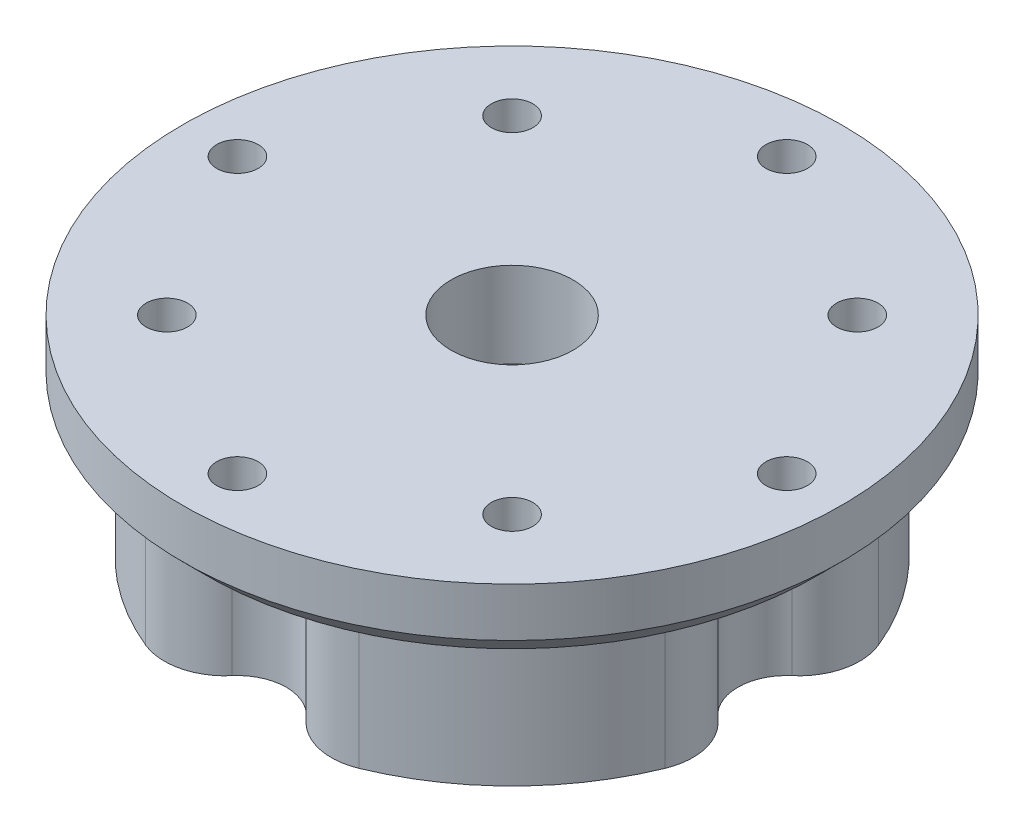
ISO-10303-21;
HEADER;
FILE_DESCRIPTION(('STEP AP214'),'2;1');
FILE_NAME('part.step','',(''),(''),'','','');
FILE_SCHEMA(('AUTOMOTIVE_DESIGN { 1 0 10303 214 1 1 1 1 }'));
ENDSEC;
DATA;
#1=APPLICATION_CONTEXT('core data for automotive mechanical design processes');
#2=APPLICATION_PROTOCOL_DEFINITION('international standard','automotive_design',2000,#1);
#3=PRODUCT_CONTEXT('',#1,'mechanical');
#4=PRODUCT('Part','Part','',(#3));
#5=PRODUCT_RELATED_PRODUCT_CATEGORY('part','',(#4));
#6=PRODUCT_DEFINITION_FORMATION('','',#4);
#7=PRODUCT_DEFINITION_CONTEXT('part definition',#1,'design');
#8=PRODUCT_DEFINITION('design','',#6,#7);
#9=PRODUCT_DEFINITION_SHAPE('','',#8);
#10=(LENGTH_UNIT() NAMED_UNIT(*) SI_UNIT(.MILLI.,.METRE.));
#11=(NAMED_UNIT(*) PLANE_ANGLE_UNIT() SI_UNIT($,.RADIAN.));
#12=(NAMED_UNIT(*) SI_UNIT($,.STERADIAN.) SOLID_ANGLE_UNIT());
#13=UNCERTAINTY_MEASURE_WITH_UNIT(LENGTH_MEASURE(1.E-05),#10,'distance_accuracy_value','');
#14=(GEOMETRIC_REPRESENTATION_CONTEXT(3) GLOBAL_UNCERTAINTY_ASSIGNED_CONTEXT((#13)) GLOBAL_UNIT_ASSIGNED_CONTEXT((#10,
#11,#12)) REPRESENTATION_CONTEXT('',''));
#15=CARTESIAN_POINT('',(0.,0.,0.));
#16=DIRECTION('',(0.,0.,1.));
#17=DIRECTION('',(1.,0.,0.));
#18=AXIS2_PLACEMENT_3D('',#15,#16,#17);
#19=CARTESIAN_POINT('',(0.,0.,-22.5));
#20=DIRECTION('',(0.,-1.,0.));
#21=DIRECTION('',(0.,0.,-1.));
#22=AXIS2_PLACEMENT_3D('',#19,#20,#21);
#23=CYLINDRICAL_SURFACE('',#22,1.69999999999999);
#24=CARTESIAN_POINT('',(0.,17.156,-22.5));
#25=DIRECTION('',(0.,-1.,0.));
#26=DIRECTION('',(0.,0.,-1.));
#27=AXIS2_PLACEMENT_3D('',#24,#25,#26);
#28=CIRCLE('',#27,1.7);
#29=CARTESIAN_POINT('',(0.,17.156,-24.2));
#30=VERTEX_POINT('',#29);
#31=EDGE_CURVE('E460',#30,#30,#28,.T.);
#32=ORIENTED_EDGE('',*,*,#31,.F.);
#33=EDGE_LOOP('',(#32));
#34=FACE_BOUND('',#33,.T.);
#35=CARTESIAN_POINT('',(0.,11.156,-22.5));
#36=DIRECTION('',(0.,-1.,0.));
#37=DIRECTION('',(0.,0.,-1.));
#38=AXIS2_PLACEMENT_3D('',#35,#36,#37);
#39=CIRCLE('',#38,1.69999999999999);
#40=CARTESIAN_POINT('',(0.,11.156,-24.2));
#41=VERTEX_POINT('',#40);
#42=EDGE_CURVE('E464',#41,#41,#39,.T.);
#43=ORIENTED_EDGE('',*,*,#42,.T.);
#44=EDGE_LOOP('',(#43));
#45=FACE_BOUND('',#44,.T.);
#46=ADVANCED_FACE('F49',(#34,#45),#23,.F.);
#47=CARTESIAN_POINT('',(22.5,0.,0.));
#48=DIRECTION('',(0.,-1.,0.));
#49=DIRECTION('',(0.,0.,-1.));
#50=AXIS2_PLACEMENT_3D('',#47,#48,#49);
#51=CYLINDRICAL_SURFACE('',#50,1.69999999999999);
#52=CARTESIAN_POINT('',(22.5,17.156,0.));
#53=DIRECTION('',(0.,-1.,0.));
#54=DIRECTION('',(0.,0.,-1.));
#55=AXIS2_PLACEMENT_3D('',#52,#53,#54);
#56=CIRCLE('',#55,1.7);
#57=CARTESIAN_POINT('',(22.5,17.156,-1.7));
#58=VERTEX_POINT('',#57);
#59=EDGE_CURVE('E444',#58,#58,#56,.T.);
#60=ORIENTED_EDGE('',*,*,#59,.F.);
#61=EDGE_LOOP('',(#60));
#62=FACE_BOUND('',#61,.T.);
#63=CARTESIAN_POINT('',(22.5,11.156,0.));
#64=DIRECTION('',(0.,-1.,0.));
#65=DIRECTION('',(0.,0.,-1.));
#66=AXIS2_PLACEMENT_3D('',#63,#64,#65);
#67=CIRCLE('',#66,1.69999999999999);
#68=CARTESIAN_POINT('',(22.5,11.156,-1.69999999999999));
#69=VERTEX_POINT('',#68);
#70=EDGE_CURVE('E448',#69,#69,#67,.T.);
#71=ORIENTED_EDGE('',*,*,#70,.T.);
#72=EDGE_LOOP('',(#71));
#73=FACE_BOUND('',#72,.T.);
#74=ADVANCED_FACE('F311',(#62,#73),#51,.F.);
#75=CARTESIAN_POINT('',(-2.35674990371912E-13,0.,22.5));
#76=DIRECTION('',(0.,-1.,0.));
#77=DIRECTION('',(0.,0.,-1.));
#78=AXIS2_PLACEMENT_3D('',#75,#76,#77);
#79=CYLINDRICAL_SURFACE('',#78,1.69999999999999);
#80=CARTESIAN_POINT('',(-2.35674990371912E-13,17.156,22.5));
#81=DIRECTION('',(0.,-1.,0.));
#82=DIRECTION('',(0.,0.,-1.));
#83=AXIS2_PLACEMENT_3D('',#80,#81,#82);
#84=CIRCLE('',#83,1.7);
#85=CARTESIAN_POINT('',(-2.35674990371912E-13,17.156,20.8));
#86=VERTEX_POINT('',#85);
#87=EDGE_CURVE('E427',#86,#86,#84,.T.);
#88=ORIENTED_EDGE('',*,*,#87,.F.);
#89=EDGE_LOOP('',(#88));
#90=FACE_BOUND('',#89,.T.);
#91=CARTESIAN_POINT('',(-2.35674990371912E-13,11.156,22.5));
#92=DIRECTION('',(0.,-1.,0.));
#93=DIRECTION('',(0.,0.,-1.));
#94=AXIS2_PLACEMENT_3D('',#91,#92,#93);
#95=CIRCLE('',#94,1.69999999999999);
#96=CARTESIAN_POINT('',(-2.35674990371912E-13,11.156,20.8));
#97=VERTEX_POINT('',#96);
#98=EDGE_CURVE('E431',#97,#97,#95,.T.);
#99=ORIENTED_EDGE('',*,*,#98,.T.);
#100=EDGE_LOOP('',(#99));
#101=FACE_BOUND('',#100,.T.);
#102=ADVANCED_FACE('F318',(#90,#101),#79,.F.);
#103=CARTESIAN_POINT('',(0.,17.156,0.));
#104=DIRECTION('',(0.,1.,0.));
#105=DIRECTION('',(0.,0.,1.));
#106=AXIS2_PLACEMENT_3D('',#103,#104,#105);
#107=PLANE('',#106);
#108=CARTESIAN_POINT('',(0.,17.156,0.));
#109=DIRECTION('',(0.,1.,0.));
#110=DIRECTION('',(0.,0.,1.));
#111=AXIS2_PLACEMENT_3D('',#108,#109,#110);
#112=CIRCLE('',#111,5.);
#113=CARTESIAN_POINT('',(0.,17.156,5.));
#114=VERTEX_POINT('',#113);
#115=EDGE_CURVE('E566',#114,#114,#112,.T.);
#116=ORIENTED_EDGE('',*,*,#115,.F.);
#117=EDGE_LOOP('',(#116));
#118=FACE_BOUND('',#117,.T.);
#119=CARTESIAN_POINT('',(-14.1421356237311,17.156,14.1421356237308));
#120=DIRECTION('',(0.,-1.,0.));
#121=DIRECTION('',(0.,0.,-1.));
#122=AXIS2_PLACEMENT_3D('',#119,#120,#121);
#123=CIRCLE('',#122,1.7);
#124=CARTESIAN_POINT('',(-14.1421356237311,17.156,12.4421356237308));
#125=VERTEX_POINT('',#124);
#126=EDGE_CURVE('E440',#125,#125,#123,.T.);
#127=ORIENTED_EDGE('',*,*,#126,.T.);
#128=EDGE_LOOP('',(#127));
#129=FACE_BOUND('',#128,.T.);
#130=ORIENTED_EDGE('',*,*,#59,.T.);
#131=EDGE_LOOP('',(#130));
#132=FACE_BOUND('',#131,.T.);
#133=CARTESIAN_POINT('',(0.,17.156,0.));
#134=DIRECTION('',(0.,-1.,0.));
#135=DIRECTION('',(0.,0.,-1.));
#136=AXIS2_PLACEMENT_3D('',#133,#134,#135);
#137=CIRCLE('',#136,27.);
#138=CARTESIAN_POINT('',(0.,17.156,-27.));
#139=VERTEX_POINT('',#138);
#140=EDGE_CURVE('E191',#139,#139,#137,.T.);
#141=ORIENTED_EDGE('',*,*,#140,.F.);
#142=EDGE_LOOP('',(#141));
#143=FACE_BOUND('',#142,.T.);
#144=CARTESIAN_POINT('',(-14.1421356237309,17.156,-14.142135623731));
#145=DIRECTION('',(0.,-1.,0.));
#146=DIRECTION('',(0.,0.,-1.));
#147=AXIS2_PLACEMENT_3D('',#144,#145,#146);
#148=CIRCLE('',#147,1.7);
#149=CARTESIAN_POINT('',(-14.1421356237309,17.156,-15.842135623731));
#150=VERTEX_POINT('',#149);
#151=EDGE_CURVE('E495',#150,#150,#148,.T.);
#152=ORIENTED_EDGE('',*,*,#151,.T.);
#153=EDGE_LOOP('',(#152));
#154=FACE_BOUND('',#153,.T.);
#155=CARTESIAN_POINT('',(-22.5,17.156,0.));
#156=DIRECTION('',(0.,-1.,0.));
#157=DIRECTION('',(0.,0.,-1.));
#158=AXIS2_PLACEMENT_3D('',#155,#156,#157);
#159=CIRCLE('',#158,1.7);
#160=CARTESIAN_POINT('',(-22.5,17.156,-1.7));
#161=VERTEX_POINT('',#160);
#162=EDGE_CURVE('E483',#161,#161,#159,.T.);
#163=ORIENTED_EDGE('',*,*,#162,.T.);
#164=EDGE_LOOP('',(#163));
#165=FACE_BOUND('',#164,.T.);
#166=CARTESIAN_POINT('',(14.142135623731,17.156,-14.1421356237309));
#167=DIRECTION('',(0.,-1.,0.));
#168=DIRECTION('',(0.,0.,-1.));
#169=AXIS2_PLACEMENT_3D('',#166,#167,#168);
#170=CIRCLE('',#169,1.69999999999999);
#171=CARTESIAN_POINT('',(14.142135623731,17.156,-15.8421356237309));
#172=VERTEX_POINT('',#171);
#173=EDGE_CURVE('E472',#172,#172,#170,.T.);
#174=ORIENTED_EDGE('',*,*,#173,.T.);
#175=EDGE_LOOP('',(#174));
#176=FACE_BOUND('',#175,.T.);
#177=ORIENTED_EDGE('',*,*,#31,.T.);
#178=EDGE_LOOP('',(#177));
#179=FACE_BOUND('',#178,.T.);
#180=CARTESIAN_POINT('',(14.1421356237309,17.156,14.142135623731));
#181=DIRECTION('',(0.,-1.,0.));
#182=DIRECTION('',(0.,0.,-1.));
#183=AXIS2_PLACEMENT_3D('',#180,#181,#182);
#184=CIRCLE('',#183,1.7);
#185=CARTESIAN_POINT('',(14.1421356237309,17.156,12.442135623731));
#186=VERTEX_POINT('',#185);
#187=EDGE_CURVE('E456',#186,#186,#184,.T.);
#188=ORIENTED_EDGE('',*,*,#187,.T.);
#189=EDGE_LOOP('',(#188));
#190=FACE_BOUND('',#189,.T.);
#191=ORIENTED_EDGE('',*,*,#87,.T.);
#192=EDGE_LOOP('',(#191));
#193=FACE_BOUND('',#192,.T.);
#194=ADVANCED_FACE('F354',(#118,#129,#132,#143,#154,#165,#176,#179,#190,#193),#107,.T.);
#195=CARTESIAN_POINT('',(0.,0.,0.));
#196=DIRECTION('',(0.,-1.,0.));
#197=DIRECTION('',(0.,0.,-1.));
#198=AXIS2_PLACEMENT_3D('',#195,#196,#197);
#199=CYLINDRICAL_SURFACE('',#198,23.);
#200=CARTESIAN_POINT('',(0.,0.,0.));
#201=DIRECTION('',(0.,-1.,0.));
#202=DIRECTION('',(0.,0.,-1.));
#203=AXIS2_PLACEMENT_3D('',#200,#201,#202);
#204=CIRCLE('',#203,23.);
#205=CARTESIAN_POINT('',(-8.73924338830336,0.,21.2749999999999));
#206=VERTEX_POINT('',#205);
#207=CARTESIAN_POINT('',(-21.275,0.,8.73924338830313));
#208=VERTEX_POINT('',#207);
#209=EDGE_CURVE('E499',#206,#208,#204,.T.);
#210=ORIENTED_EDGE('',*,*,#209,.F.);
#211=DIRECTION('',(0.,-1.,0.));
#212=VECTOR('',#211,1.);
#213=CARTESIAN_POINT('',(-8.73924338830336,0.,21.2749999999999));
#214=LINE('',#213,#212);
#215=CARTESIAN_POINT('',(-8.73924338830336,11.156,21.2749999999999));
#216=VERTEX_POINT('',#215);
#217=EDGE_CURVE('E66',#206,#216,#214,.F.);
#218=ORIENTED_EDGE('',*,*,#217,.T.);
#219=CARTESIAN_POINT('',(0.,11.156,0.));
#220=DIRECTION('',(0.,-1.,0.));
#221=DIRECTION('',(0.,0.,-1.));
#222=AXIS2_PLACEMENT_3D('',#219,#220,#221);
#223=CIRCLE('',#222,23.);
#224=CARTESIAN_POINT('',(-21.275,11.156,8.73924338830313));
#225=VERTEX_POINT('',#224);
#226=EDGE_CURVE('E194',#216,#225,#223,.T.);
#227=ORIENTED_EDGE('',*,*,#226,.T.);
#228=DIRECTION('',(0.,-1.,0.));
#229=VECTOR('',#228,1.);
#230=CARTESIAN_POINT('',(-21.275,0.,8.73924338830314));
#231=LINE('',#230,#229);
#232=EDGE_CURVE('E178',#225,#208,#231,.T.);
#233=ORIENTED_EDGE('',*,*,#232,.T.);
#234=EDGE_LOOP('',(#210,#218,#227,#233));
#235=FACE_BOUND('',#234,.T.);
#236=ADVANCED_FACE('F347',(#235),#199,.T.);
#237=CARTESIAN_POINT('',(21.275,11.156,8.73924338830313));
#238=VERTEX_POINT('',#237);
#239=CARTESIAN_POINT('',(8.73924338830291,11.156,21.2750000000001));
#240=VERTEX_POINT('',#239);
#241=EDGE_CURVE('E526',#238,#240,#223,.T.);
#242=ORIENTED_EDGE('',*,*,#241,.T.);
#243=DIRECTION('',(0.,-1.,0.));
#244=VECTOR('',#243,1.);
#245=CARTESIAN_POINT('',(8.73924338830291,0.,21.2750000000001));
#246=LINE('',#245,#244);
#247=CARTESIAN_POINT('',(8.73924338830291,0.,21.2750000000001));
#248=VERTEX_POINT('',#247);
#249=EDGE_CURVE('E258',#240,#248,#246,.T.);
#250=ORIENTED_EDGE('',*,*,#249,.T.);
#251=CARTESIAN_POINT('',(21.275,0.,8.73924338830313));
#252=VERTEX_POINT('',#251);
#253=EDGE_CURVE('E855',#252,#248,#204,.T.);
#254=ORIENTED_EDGE('',*,*,#253,.F.);
#255=DIRECTION('',(0.,-1.,0.));
#256=VECTOR('',#255,1.);
#257=CARTESIAN_POINT('',(21.275,0.,8.73924338830314));
#258=LINE('',#257,#256);
#259=EDGE_CURVE('E249',#252,#238,#258,.F.);
#260=ORIENTED_EDGE('',*,*,#259,.T.);
#261=EDGE_LOOP('',(#242,#250,#254,#260));
#262=FACE_BOUND('',#261,.T.);
#263=ADVANCED_FACE('F644',(#262),#199,.T.);
#264=CARTESIAN_POINT('',(8.73924338830321,11.156,-21.275));
#265=VERTEX_POINT('',#264);
#266=CARTESIAN_POINT('',(21.275,11.156,-8.73924338830313));
#267=VERTEX_POINT('',#266);
#268=EDGE_CURVE('E192',#265,#267,#223,.T.);
#269=ORIENTED_EDGE('',*,*,#268,.T.);
#270=DIRECTION('',(0.,-1.,0.));
#271=VECTOR('',#270,1.);
#272=CARTESIAN_POINT('',(21.275,0.,-8.73924338830314));
#273=LINE('',#272,#271);
#274=CARTESIAN_POINT('',(21.275,0.,-8.73924338830313));
#275=VERTEX_POINT('',#274);
#276=EDGE_CURVE('E232',#267,#275,#273,.T.);
#277=ORIENTED_EDGE('',*,*,#276,.T.);
#278=CARTESIAN_POINT('',(8.73924338830321,0.,-21.275));
#279=VERTEX_POINT('',#278);
#280=EDGE_CURVE('E501',#279,#275,#204,.T.);
#281=ORIENTED_EDGE('',*,*,#280,.F.);
#282=DIRECTION('',(0.,-1.,0.));
#283=VECTOR('',#282,1.);
#284=CARTESIAN_POINT('',(8.73924338830321,0.,-21.275));
#285=LINE('',#284,#283);
#286=EDGE_CURVE('E224',#279,#265,#285,.F.);
#287=ORIENTED_EDGE('',*,*,#286,.T.);
#288=EDGE_LOOP('',(#269,#277,#281,#287));
#289=FACE_BOUND('',#288,.T.);
#290=ADVANCED_FACE('F340',(#289),#199,.T.);
#291=CARTESIAN_POINT('',(-22.5,0.,0.));
#292=DIRECTION('',(0.,-1.,0.));
#293=DIRECTION('',(0.,0.,-1.));
#294=AXIS2_PLACEMENT_3D('',#291,#292,#293);
#295=CYLINDRICAL_SURFACE('',#294,1.69999999999999);
#296=ORIENTED_EDGE('',*,*,#162,.F.);
#297=EDGE_LOOP('',(#296));
#298=FACE_BOUND('',#297,.T.);
#299=CARTESIAN_POINT('',(-22.5,11.156,0.));
#300=DIRECTION('',(0.,-1.,0.));
#301=DIRECTION('',(0.,0.,-1.));
#302=AXIS2_PLACEMENT_3D('',#299,#300,#301);
#303=CIRCLE('',#302,1.69999999999999);
#304=CARTESIAN_POINT('',(-22.5,11.156,-1.69999999999999));
#305=VERTEX_POINT('',#304);
#306=EDGE_CURVE('E487',#305,#305,#303,.T.);
#307=ORIENTED_EDGE('',*,*,#306,.T.);
#308=EDGE_LOOP('',(#307));
#309=FACE_BOUND('',#308,.T.);
#310=ADVANCED_FACE('F336',(#298,#309),#295,.F.);
#311=CARTESIAN_POINT('',(23.,0.,0.));
#312=DIRECTION('',(0.,-1.,0.));
#313=DIRECTION('',(0.,0.,-1.));
#314=AXIS2_PLACEMENT_3D('',#311,#312,#313);
#315=PLANE('',#314);
#316=CARTESIAN_POINT('',(0.,0.,0.));
#317=DIRECTION('',(0.,-1.,0.));
#318=DIRECTION('',(0.,0.,-1.));
#319=AXIS2_PLACEMENT_3D('',#316,#317,#318);
#320=CIRCLE('',#319,7.55);
#321=CARTESIAN_POINT('',(0.,0.,-7.55));
#322=VERTEX_POINT('',#321);
#323=EDGE_CURVE('E292',#322,#322,#320,.F.);
#324=ORIENTED_EDGE('',*,*,#323,.T.);
#325=EDGE_LOOP('',(#324));
#326=FACE_BOUND('',#325,.T.);
#327=ORIENTED_EDGE('',*,*,#253,.T.);
#328=CARTESIAN_POINT('',(6.83940786910663,0.,16.6500000000001));
#329=DIRECTION('',(0.,-1.,0.));
#330=DIRECTION('',(0.,0.,-1.));
#331=AXIS2_PLACEMENT_3D('',#328,#329,#330);
#332=CIRCLE('',#331,5.);
#333=CARTESIAN_POINT('',(3.03973683071393,0.,19.9));
#334=VERTEX_POINT('',#333);
#335=EDGE_CURVE('E265',#248,#334,#332,.T.);
#336=ORIENTED_EDGE('',*,*,#335,.T.);
#337=CARTESIAN_POINT('',(-2.35674990371912E-13,0.,22.5));
#338=DIRECTION('',(0.,-1.,0.));
#339=DIRECTION('',(-1.,0.,0.));
#340=AXIS2_PLACEMENT_3D('',#337,#338,#339);
#341=CIRCLE('',#340,4.);
#342=CARTESIAN_POINT('',(-3.03973683071434,0.,19.9));
#343=VERTEX_POINT('',#342);
#344=EDGE_CURVE('E287',#343,#334,#341,.T.);
#345=ORIENTED_EDGE('',*,*,#344,.F.);
#346=CARTESIAN_POINT('',(-6.83940786910697,0.,16.6499999999999));
#347=DIRECTION('',(0.,-1.,0.));
#348=DIRECTION('',(0.,0.,-1.));
#349=AXIS2_PLACEMENT_3D('',#346,#347,#348);
#350=CIRCLE('',#349,5.);
#351=EDGE_CURVE('E262',#343,#206,#350,.T.);
#352=ORIENTED_EDGE('',*,*,#351,.T.);
#353=ORIENTED_EDGE('',*,*,#209,.T.);
#354=CARTESIAN_POINT('',(-16.65,0.,6.8394078691068));
#355=DIRECTION('',(0.,-1.,0.));
#356=DIRECTION('',(0.,0.,-1.));
#357=AXIS2_PLACEMENT_3D('',#354,#355,#356);
#358=CIRCLE('',#357,5.);
#359=CARTESIAN_POINT('',(-19.9,0.,3.03973683071413));
#360=VERTEX_POINT('',#359);
#361=EDGE_CURVE('E515',#208,#360,#358,.T.);
#362=ORIENTED_EDGE('',*,*,#361,.T.);
#363=CARTESIAN_POINT('',(-22.5,0.,0.));
#364=DIRECTION('',(0.,-1.,0.));
#365=DIRECTION('',(0.,0.,-1.));
#366=AXIS2_PLACEMENT_3D('',#363,#364,#365);
#367=CIRCLE('',#366,4.);
#368=CARTESIAN_POINT('',(-19.9,0.,-3.03973683071413));
#369=VERTEX_POINT('',#368);
#370=EDGE_CURVE('E476',#369,#360,#367,.T.);
#371=ORIENTED_EDGE('',*,*,#370,.F.);
#372=CARTESIAN_POINT('',(-16.65,0.,-6.8394078691068));
#373=DIRECTION('',(0.,-1.,0.));
#374=DIRECTION('',(0.,0.,-1.));
#375=AXIS2_PLACEMENT_3D('',#372,#373,#374);
#376=CIRCLE('',#375,5.);
#377=CARTESIAN_POINT('',(-21.275,0.,-8.73924338830313));
#378=VERTEX_POINT('',#377);
#379=EDGE_CURVE('E512',#369,#378,#376,.T.);
#380=ORIENTED_EDGE('',*,*,#379,.T.);
#381=CARTESIAN_POINT('',(-8.73924338830306,0.,-21.275));
#382=VERTEX_POINT('',#381);
#383=EDGE_CURVE('E174',#378,#382,#204,.T.);
#384=ORIENTED_EDGE('',*,*,#383,.T.);
#385=CARTESIAN_POINT('',(-6.83940786910674,0.,-16.65));
#386=DIRECTION('',(0.,-1.,0.));
#387=DIRECTION('',(0.,0.,-1.));
#388=AXIS2_PLACEMENT_3D('',#385,#386,#387);
#389=CIRCLE('',#388,5.);
#390=CARTESIAN_POINT('',(-3.03973683071406,0.,-19.9));
#391=VERTEX_POINT('',#390);
#392=EDGE_CURVE('E214',#382,#391,#389,.T.);
#393=ORIENTED_EDGE('',*,*,#392,.T.);
#394=CARTESIAN_POINT('',(0.,0.,-22.5));
#395=DIRECTION('',(0.,-1.,0.));
#396=DIRECTION('',(1.,0.,0.));
#397=AXIS2_PLACEMENT_3D('',#394,#395,#396);
#398=CIRCLE('',#397,4.);
#399=CARTESIAN_POINT('',(3.0397368307142,0.,-19.9));
#400=VERTEX_POINT('',#399);
#401=EDGE_CURVE('E551',#400,#391,#398,.T.);
#402=ORIENTED_EDGE('',*,*,#401,.F.);
#403=CARTESIAN_POINT('',(6.83940786910686,0.,-16.65));
#404=DIRECTION('',(0.,-1.,0.));
#405=DIRECTION('',(0.,0.,-1.));
#406=AXIS2_PLACEMENT_3D('',#403,#404,#405);
#407=CIRCLE('',#406,5.);
#408=EDGE_CURVE('E205',#400,#279,#407,.T.);
#409=ORIENTED_EDGE('',*,*,#408,.T.);
#410=ORIENTED_EDGE('',*,*,#280,.T.);
#411=CARTESIAN_POINT('',(16.65,0.,-6.8394078691068));
#412=DIRECTION('',(0.,-1.,0.));
#413=DIRECTION('',(0.,0.,-1.));
#414=AXIS2_PLACEMENT_3D('',#411,#412,#413);
#415=CIRCLE('',#414,5.);
#416=CARTESIAN_POINT('',(19.9,0.,-3.03973683071413));
#417=VERTEX_POINT('',#416);
#418=EDGE_CURVE('E239',#275,#417,#415,.T.);
#419=ORIENTED_EDGE('',*,*,#418,.T.);
#420=CARTESIAN_POINT('',(22.5,0.,0.));
#421=DIRECTION('',(0.,-1.,0.));
#422=DIRECTION('',(0.,0.,1.));
#423=AXIS2_PLACEMENT_3D('',#420,#421,#422);
#424=CIRCLE('',#423,4.);
#425=CARTESIAN_POINT('',(19.9,0.,3.03973683071413));
#426=VERTEX_POINT('',#425);
#427=EDGE_CURVE('E421',#426,#417,#424,.T.);
#428=ORIENTED_EDGE('',*,*,#427,.F.);
#429=CARTESIAN_POINT('',(16.65,0.,6.8394078691068));
#430=DIRECTION('',(0.,-1.,0.));
#431=DIRECTION('',(0.,0.,-1.));
#432=AXIS2_PLACEMENT_3D('',#429,#430,#431);
#433=CIRCLE('',#432,5.);
#434=EDGE_CURVE('E236',#426,#252,#433,.T.);
#435=ORIENTED_EDGE('',*,*,#434,.T.);
#436=EDGE_LOOP('',(#327,#336,#345,#352,#353,#362,#371,#380,#384,#393,#402,#409,#410,#419,#428,#435));
#437=FACE_BOUND('',#436,.T.);
#438=CARTESIAN_POINT('',(-14.1421356237311,0.,14.1421356237308));
#439=DIRECTION('',(0.,-1.,0.));
#440=DIRECTION('',(0.,0.,-1.));
#441=AXIS2_PLACEMENT_3D('',#438,#439,#440);
#442=CIRCLE('',#441,1.69999999999999);
#443=CARTESIAN_POINT('',(-14.1421356237311,0.,12.4421356237308));
#444=VERTEX_POINT('',#443);
#445=EDGE_CURVE('E436',#444,#444,#442,.T.);
#446=ORIENTED_EDGE('',*,*,#445,.F.);
#447=EDGE_LOOP('',(#446));
#448=FACE_BOUND('',#447,.T.);
#449=CARTESIAN_POINT('',(14.1421356237309,0.,14.142135623731));
#450=DIRECTION('',(0.,-1.,0.));
#451=DIRECTION('',(0.,0.,-1.));
#452=AXIS2_PLACEMENT_3D('',#449,#450,#451);
#453=CIRCLE('',#452,1.69999999999999);
#454=CARTESIAN_POINT('',(14.1421356237309,0.,12.442135623731));
#455=VERTEX_POINT('',#454);
#456=EDGE_CURVE('E452',#455,#455,#453,.T.);
#457=ORIENTED_EDGE('',*,*,#456,.F.);
#458=EDGE_LOOP('',(#457));
#459=FACE_BOUND('',#458,.T.);
#460=CARTESIAN_POINT('',(14.142135623731,0.,-14.1421356237309));
#461=DIRECTION('',(0.,-1.,0.));
#462=DIRECTION('',(0.,0.,-1.));
#463=AXIS2_PLACEMENT_3D('',#460,#461,#462);
#464=CIRCLE('',#463,1.69999999999999);
#465=CARTESIAN_POINT('',(14.142135623731,0.,-15.8421356237309));
#466=VERTEX_POINT('',#465);
#467=EDGE_CURVE('E468',#466,#466,#464,.T.);
#468=ORIENTED_EDGE('',*,*,#467,.F.);
#469=EDGE_LOOP('',(#468));
#470=FACE_BOUND('',#469,.T.);
#471=CARTESIAN_POINT('',(-14.1421356237309,0.,-14.142135623731));
#472=DIRECTION('',(0.,-1.,0.));
#473=DIRECTION('',(0.,0.,-1.));
#474=AXIS2_PLACEMENT_3D('',#471,#472,#473);
#475=CIRCLE('',#474,1.69999999999999);
#476=CARTESIAN_POINT('',(-14.1421356237309,0.,-15.842135623731));
#477=VERTEX_POINT('',#476);
#478=EDGE_CURVE('E491',#477,#477,#475,.T.);
#479=ORIENTED_EDGE('',*,*,#478,.F.);
#480=EDGE_LOOP('',(#479));
#481=FACE_BOUND('',#480,.T.);
#482=ADVANCED_FACE('F339',(#326,#437,#448,#459,#470,#481),#315,.T.);
#483=CARTESIAN_POINT('',(0.,0.,0.));
#484=DIRECTION('',(0.,-1.,0.));
#485=DIRECTION('',(0.,0.,-1.));
#486=AXIS2_PLACEMENT_3D('',#483,#484,#485);
#487=CYLINDRICAL_SURFACE('',#486,6.8);
#488=CARTESIAN_POINT('',(0.,0.749999999999996,0.));
#489=DIRECTION('',(0.,-1.,0.));
#490=DIRECTION('',(0.,0.,-1.));
#491=AXIS2_PLACEMENT_3D('',#488,#489,#490);
#492=CIRCLE('',#491,6.8);
#493=CARTESIAN_POINT('',(0.,0.749999999999996,-6.8));
#494=VERTEX_POINT('',#493);
#495=EDGE_CURVE('E282',#494,#494,#492,.T.);
#496=ORIENTED_EDGE('',*,*,#495,.T.);
#497=EDGE_LOOP('',(#496));
#498=FACE_BOUND('',#497,.T.);
#499=CARTESIAN_POINT('',(0.,4.953,0.));
#500=DIRECTION('',(0.,-1.,0.));
#501=DIRECTION('',(0.,0.,-1.));
#502=AXIS2_PLACEMENT_3D('',#499,#500,#501);
#503=CIRCLE('',#502,6.8);
#504=CARTESIAN_POINT('',(0.,4.953,-6.8));
#505=VERTEX_POINT('',#504);
#506=EDGE_CURVE('E179',#505,#505,#503,.T.);
#507=ORIENTED_EDGE('',*,*,#506,.F.);
#508=EDGE_LOOP('',(#507));
#509=FACE_BOUND('',#508,.T.);
#510=ADVANCED_FACE('F360',(#498,#509),#487,.F.);
#511=CARTESIAN_POINT('',(6.8,4.953,0.));
#512=DIRECTION('',(0.,-1.,0.));
#513=DIRECTION('',(0.,0.,-1.));
#514=AXIS2_PLACEMENT_3D('',#511,#512,#513);
#515=PLANE('',#514);
#516=CARTESIAN_POINT('',(0.,4.953,0.));
#517=DIRECTION('',(0.,-1.,0.));
#518=DIRECTION('',(0.,0.,-1.));
#519=AXIS2_PLACEMENT_3D('',#516,#517,#518);
#520=CIRCLE('',#519,2.75);
#521=CARTESIAN_POINT('',(0.,4.953,-2.75));
#522=VERTEX_POINT('',#521);
#523=EDGE_CURVE('E283',#522,#522,#520,.T.);
#524=ORIENTED_EDGE('',*,*,#523,.F.);
#525=EDGE_LOOP('',(#524));
#526=FACE_BOUND('',#525,.T.);
#527=ORIENTED_EDGE('',*,*,#506,.T.);
#528=EDGE_LOOP('',(#527));
#529=FACE_BOUND('',#528,.T.);
#530=ADVANCED_FACE('F352',(#526,#529),#515,.T.);
#531=CARTESIAN_POINT('',(0.,0.,0.));
#532=DIRECTION('',(0.,-1.,0.));
#533=DIRECTION('',(0.,0.,-1.));
#534=AXIS2_PLACEMENT_3D('',#531,#532,#533);
#535=CYLINDRICAL_SURFACE('',#534,27.);
#536=CARTESIAN_POINT('',(0.,13.156,0.));
#537=DIRECTION('',(0.,-1.,0.));
#538=DIRECTION('',(0.,0.,-1.));
#539=AXIS2_PLACEMENT_3D('',#536,#537,#538);
#540=CIRCLE('',#539,27.);
#541=CARTESIAN_POINT('',(0.,13.156,-27.));
#542=VERTEX_POINT('',#541);
#543=EDGE_CURVE('E11',#542,#542,#540,.F.);
#544=ORIENTED_EDGE('',*,*,#543,.T.);
#545=EDGE_LOOP('',(#544));
#546=FACE_BOUND('',#545,.T.);
#547=ORIENTED_EDGE('',*,*,#140,.T.);
#548=EDGE_LOOP('',(#547));
#549=FACE_BOUND('',#548,.T.);
#550=ADVANCED_FACE('F349',(#546,#549),#535,.T.);
#551=CARTESIAN_POINT('',(23.,11.156,0.));
#552=DIRECTION('',(0.,-1.,0.));
#553=DIRECTION('',(0.,0.,-1.));
#554=AXIS2_PLACEMENT_3D('',#551,#552,#553);
#555=PLANE('',#554);
#556=CARTESIAN_POINT('',(0.,11.156,0.));
#557=DIRECTION('',(0.,-1.,0.));
#558=DIRECTION('',(0.,0.,-1.));
#559=AXIS2_PLACEMENT_3D('',#556,#557,#558);
#560=CIRCLE('',#559,25.);
#561=CARTESIAN_POINT('',(0.,11.156,-25.));
#562=VERTEX_POINT('',#561);
#563=EDGE_CURVE('E59',#562,#562,#560,.T.);
#564=ORIENTED_EDGE('',*,*,#563,.T.);
#565=EDGE_LOOP('',(#564));
#566=FACE_BOUND('',#565,.T.);
#567=ORIENTED_EDGE('',*,*,#268,.F.);
#568=CARTESIAN_POINT('',(6.83940786910686,11.156,-16.65));
#569=DIRECTION('',(0.,-1.,0.));
#570=DIRECTION('',(0.,0.,-1.));
#571=AXIS2_PLACEMENT_3D('',#568,#569,#570);
#572=CIRCLE('',#571,5.);
#573=CARTESIAN_POINT('',(3.0397368307142,11.156,-19.9));
#574=VERTEX_POINT('',#573);
#575=EDGE_CURVE('E229',#265,#574,#572,.F.);
#576=ORIENTED_EDGE('',*,*,#575,.T.);
#577=CARTESIAN_POINT('',(0.,11.156,-22.5));
#578=DIRECTION('',(0.,-1.,0.));
#579=DIRECTION('',(0.,0.,-1.));
#580=AXIS2_PLACEMENT_3D('',#577,#578,#579);
#581=CIRCLE('',#580,4.);
#582=CARTESIAN_POINT('',(-3.03973683071406,11.156,-19.9));
#583=VERTEX_POINT('',#582);
#584=EDGE_CURVE('E432',#583,#574,#581,.F.);
#585=ORIENTED_EDGE('',*,*,#584,.F.);
#586=CARTESIAN_POINT('',(-6.83940786910674,11.156,-16.65));
#587=DIRECTION('',(0.,-1.,0.));
#588=DIRECTION('',(0.,0.,-1.));
#589=AXIS2_PLACEMENT_3D('',#586,#587,#588);
#590=CIRCLE('',#589,5.);
#591=CARTESIAN_POINT('',(-8.73924338830306,11.156,-21.275));
#592=VERTEX_POINT('',#591);
#593=EDGE_CURVE('E189',#583,#592,#590,.F.);
#594=ORIENTED_EDGE('',*,*,#593,.T.);
#595=CARTESIAN_POINT('',(-21.275,11.156,-8.73924338830313));
#596=VERTEX_POINT('',#595);
#597=EDGE_CURVE('E171',#596,#592,#223,.T.);
#598=ORIENTED_EDGE('',*,*,#597,.F.);
#599=CARTESIAN_POINT('',(-16.65,11.156,-6.8394078691068));
#600=DIRECTION('',(0.,-1.,0.));
#601=DIRECTION('',(0.,0.,-1.));
#602=AXIS2_PLACEMENT_3D('',#599,#600,#601);
#603=CIRCLE('',#602,5.);
#604=CARTESIAN_POINT('',(-19.9,11.156,-3.03973683071413));
#605=VERTEX_POINT('',#604);
#606=EDGE_CURVE('E185',#596,#605,#603,.F.);
#607=ORIENTED_EDGE('',*,*,#606,.T.);
#608=CARTESIAN_POINT('',(-22.5,11.156,0.));
#609=DIRECTION('',(0.,-1.,0.));
#610=DIRECTION('',(0.,0.,-1.));
#611=AXIS2_PLACEMENT_3D('',#608,#609,#610);
#612=CIRCLE('',#611,4.);
#613=CARTESIAN_POINT('',(-19.9,11.156,3.03973683071413));
#614=VERTEX_POINT('',#613);
#615=EDGE_CURVE('E480',#614,#605,#612,.F.);
#616=ORIENTED_EDGE('',*,*,#615,.F.);
#617=CARTESIAN_POINT('',(-16.65,11.156,6.8394078691068));
#618=DIRECTION('',(0.,-1.,0.));
#619=DIRECTION('',(0.,0.,-1.));
#620=AXIS2_PLACEMENT_3D('',#617,#618,#619);
#621=CIRCLE('',#620,5.);
#622=EDGE_CURVE('E201',#614,#225,#621,.F.);
#623=ORIENTED_EDGE('',*,*,#622,.T.);
#624=ORIENTED_EDGE('',*,*,#226,.F.);
#625=CARTESIAN_POINT('',(-6.83940786910697,11.156,16.6499999999999));
#626=DIRECTION('',(0.,-1.,0.));
#627=DIRECTION('',(0.,0.,-1.));
#628=AXIS2_PLACEMENT_3D('',#625,#626,#627);
#629=CIRCLE('',#628,5.);
#630=CARTESIAN_POINT('',(-3.03973683071434,11.156,19.9));
#631=VERTEX_POINT('',#630);
#632=EDGE_CURVE('E73',#216,#631,#629,.F.);
#633=ORIENTED_EDGE('',*,*,#632,.T.);
#634=CARTESIAN_POINT('',(-2.35674990371912E-13,11.156,22.5));
#635=DIRECTION('',(0.,-1.,0.));
#636=DIRECTION('',(0.,0.,-1.));
#637=AXIS2_PLACEMENT_3D('',#634,#635,#636);
#638=CIRCLE('',#637,4.);
#639=CARTESIAN_POINT('',(3.03973683071393,11.156,19.9));
#640=VERTEX_POINT('',#639);
#641=EDGE_CURVE('E414',#640,#631,#638,.F.);
#642=ORIENTED_EDGE('',*,*,#641,.F.);
#643=CARTESIAN_POINT('',(6.83940786910663,11.156,16.6500000000001));
#644=DIRECTION('',(0.,-1.,0.));
#645=DIRECTION('',(0.,0.,-1.));
#646=AXIS2_PLACEMENT_3D('',#643,#644,#645);
#647=CIRCLE('',#646,5.);
#648=EDGE_CURVE('E277',#640,#240,#647,.F.);
#649=ORIENTED_EDGE('',*,*,#648,.T.);
#650=ORIENTED_EDGE('',*,*,#241,.F.);
#651=CARTESIAN_POINT('',(16.65,11.156,6.8394078691068));
#652=DIRECTION('',(0.,-1.,0.));
#653=DIRECTION('',(0.,0.,-1.));
#654=AXIS2_PLACEMENT_3D('',#651,#652,#653);
#655=CIRCLE('',#654,5.);
#656=CARTESIAN_POINT('',(19.9,11.156,3.03973683071413));
#657=VERTEX_POINT('',#656);
#658=EDGE_CURVE('E255',#238,#657,#655,.F.);
#659=ORIENTED_EDGE('',*,*,#658,.T.);
#660=CARTESIAN_POINT('',(22.5,11.156,0.));
#661=DIRECTION('',(0.,-1.,0.));
#662=DIRECTION('',(0.,0.,-1.));
#663=AXIS2_PLACEMENT_3D('',#660,#661,#662);
#664=CIRCLE('',#663,4.);
#665=CARTESIAN_POINT('',(19.9,11.156,-3.03973683071413));
#666=VERTEX_POINT('',#665);
#667=EDGE_CURVE('E424',#666,#657,#664,.F.);
#668=ORIENTED_EDGE('',*,*,#667,.F.);
#669=CARTESIAN_POINT('',(16.65,11.156,-6.8394078691068));
#670=DIRECTION('',(0.,-1.,0.));
#671=DIRECTION('',(0.,0.,-1.));
#672=AXIS2_PLACEMENT_3D('',#669,#670,#671);
#673=CIRCLE('',#672,5.);
#674=EDGE_CURVE('E252',#666,#267,#673,.F.);
#675=ORIENTED_EDGE('',*,*,#674,.T.);
#676=EDGE_LOOP('',(#567,#576,#585,#594,#598,#607,#616,#623,#624,#633,#642,#649,#650,#659,#668,#675));
#677=FACE_BOUND('',#676,.T.);
#678=ORIENTED_EDGE('',*,*,#42,.F.);
#679=EDGE_LOOP('',(#678));
#680=FACE_BOUND('',#679,.T.);
#681=ORIENTED_EDGE('',*,*,#70,.F.);
#682=EDGE_LOOP('',(#681));
#683=FACE_BOUND('',#682,.T.);
#684=ORIENTED_EDGE('',*,*,#98,.F.);
#685=EDGE_LOOP('',(#684));
#686=FACE_BOUND('',#685,.T.);
#687=ORIENTED_EDGE('',*,*,#306,.F.);
#688=EDGE_LOOP('',(#687));
#689=FACE_BOUND('',#688,.T.);
#690=ADVANCED_FACE('F182',(#566,#677,#680,#683,#686,#689),#555,.T.);
#691=ORIENTED_EDGE('',*,*,#597,.T.);
#692=DIRECTION('',(0.,-1.,0.));
#693=VECTOR('',#692,1.);
#694=CARTESIAN_POINT('',(-8.73924338830306,0.,-21.275));
#695=LINE('',#694,#693);
#696=EDGE_CURVE('E200',#592,#382,#695,.T.);
#697=ORIENTED_EDGE('',*,*,#696,.T.);
#698=ORIENTED_EDGE('',*,*,#383,.F.);
#699=DIRECTION('',(0.,-1.,0.));
#700=VECTOR('',#699,1.);
#701=CARTESIAN_POINT('',(-21.275,0.,-8.73924338830314));
#702=LINE('',#701,#700);
#703=EDGE_CURVE('E167',#378,#596,#702,.F.);
#704=ORIENTED_EDGE('',*,*,#703,.T.);
#705=EDGE_LOOP('',(#691,#697,#698,#704));
#706=FACE_BOUND('',#705,.T.);
#707=ADVANCED_FACE('F169',(#706),#199,.T.);
#708=CARTESIAN_POINT('',(-14.1421356237309,0.,-14.142135623731));
#709=DIRECTION('',(0.,-1.,0.));
#710=DIRECTION('',(0.,0.,-1.));
#711=AXIS2_PLACEMENT_3D('',#708,#709,#710);
#712=CYLINDRICAL_SURFACE('',#711,1.69999999999999);
#713=ORIENTED_EDGE('',*,*,#151,.F.);
#714=EDGE_LOOP('',(#713));
#715=FACE_BOUND('',#714,.T.);
#716=ORIENTED_EDGE('',*,*,#478,.T.);
#717=EDGE_LOOP('',(#716));
#718=FACE_BOUND('',#717,.T.);
#719=ADVANCED_FACE('F334',(#715,#718),#712,.F.);
#720=CARTESIAN_POINT('',(-22.5,20.3347798753429,0.));
#721=DIRECTION('',(0.,-1.,0.));
#722=DIRECTION('',(0.,0.,-1.));
#723=AXIS2_PLACEMENT_3D('',#720,#721,#722);
#724=CYLINDRICAL_SURFACE('',#723,4.);
#725=ORIENTED_EDGE('',*,*,#370,.T.);
#726=DIRECTION('',(0.,-1.,0.));
#727=VECTOR('',#726,1.);
#728=CARTESIAN_POINT('',(-19.9,20.3347798753429,3.03973683071413));
#729=LINE('',#728,#727);
#730=EDGE_CURVE('E208',#360,#614,#729,.F.);
#731=ORIENTED_EDGE('',*,*,#730,.T.);
#732=ORIENTED_EDGE('',*,*,#615,.T.);
#733=DIRECTION('',(0.,-1.,0.));
#734=VECTOR('',#733,1.);
#735=CARTESIAN_POINT('',(-19.9,20.3347798753429,-3.03973683071413));
#736=LINE('',#735,#734);
#737=EDGE_CURVE('E198',#605,#369,#736,.T.);
#738=ORIENTED_EDGE('',*,*,#737,.T.);
#739=EDGE_LOOP('',(#725,#731,#732,#738));
#740=FACE_BOUND('',#739,.T.);
#741=ADVANCED_FACE('F330',(#740),#724,.F.);
#742=CARTESIAN_POINT('',(-16.65,20.3347798753429,6.8394078691068));
#743=DIRECTION('',(0.,1.,0.));
#744=DIRECTION('',(0.,0.,1.));
#745=AXIS2_PLACEMENT_3D('',#742,#743,#744);
#746=CYLINDRICAL_SURFACE('',#745,5.);
#747=ORIENTED_EDGE('',*,*,#622,.F.);
#748=ORIENTED_EDGE('',*,*,#730,.F.);
#749=ORIENTED_EDGE('',*,*,#361,.F.);
#750=ORIENTED_EDGE('',*,*,#232,.F.);
#751=EDGE_LOOP('',(#747,#748,#749,#750));
#752=FACE_BOUND('',#751,.T.);
#753=ADVANCED_FACE('F333',(#752),#746,.T.);
#754=CARTESIAN_POINT('',(-16.65,0.,-6.8394078691068));
#755=DIRECTION('',(0.,1.,0.));
#756=DIRECTION('',(0.,0.,1.));
#757=AXIS2_PLACEMENT_3D('',#754,#755,#756);
#758=CYLINDRICAL_SURFACE('',#757,5.);
#759=ORIENTED_EDGE('',*,*,#606,.F.);
#760=ORIENTED_EDGE('',*,*,#703,.F.);
#761=ORIENTED_EDGE('',*,*,#379,.F.);
#762=ORIENTED_EDGE('',*,*,#737,.F.);
#763=EDGE_LOOP('',(#759,#760,#761,#762));
#764=FACE_BOUND('',#763,.T.);
#765=ADVANCED_FACE('F196',(#764),#758,.T.);
#766=CARTESIAN_POINT('',(14.142135623731,0.,-14.1421356237309));
#767=DIRECTION('',(0.,-1.,0.));
#768=DIRECTION('',(0.,0.,-1.));
#769=AXIS2_PLACEMENT_3D('',#766,#767,#768);
#770=CYLINDRICAL_SURFACE('',#769,1.69999999999999);
#771=ORIENTED_EDGE('',*,*,#173,.F.);
#772=EDGE_LOOP('',(#771));
#773=FACE_BOUND('',#772,.T.);
#774=ORIENTED_EDGE('',*,*,#467,.T.);
#775=EDGE_LOOP('',(#774));
#776=FACE_BOUND('',#775,.T.);
#777=ADVANCED_FACE('F326',(#773,#776),#770,.F.);
#778=CARTESIAN_POINT('',(14.1421356237309,0.,14.142135623731));
#779=DIRECTION('',(0.,-1.,0.));
#780=DIRECTION('',(0.,0.,-1.));
#781=AXIS2_PLACEMENT_3D('',#778,#779,#780);
#782=CYLINDRICAL_SURFACE('',#781,1.69999999999999);
#783=ORIENTED_EDGE('',*,*,#187,.F.);
#784=EDGE_LOOP('',(#783));
#785=FACE_BOUND('',#784,.T.);
#786=ORIENTED_EDGE('',*,*,#456,.T.);
#787=EDGE_LOOP('',(#786));
#788=FACE_BOUND('',#787,.T.);
#789=ADVANCED_FACE('F325',(#785,#788),#782,.F.);
#790=CARTESIAN_POINT('',(-14.1421356237311,0.,14.1421356237308));
#791=DIRECTION('',(0.,-1.,0.));
#792=DIRECTION('',(0.,0.,-1.));
#793=AXIS2_PLACEMENT_3D('',#790,#791,#792);
#794=CYLINDRICAL_SURFACE('',#793,1.69999999999999);
#795=ORIENTED_EDGE('',*,*,#126,.F.);
#796=EDGE_LOOP('',(#795));
#797=FACE_BOUND('',#796,.T.);
#798=ORIENTED_EDGE('',*,*,#445,.T.);
#799=EDGE_LOOP('',(#798));
#800=FACE_BOUND('',#799,.T.);
#801=ADVANCED_FACE('F603',(#797,#800),#794,.F.);
#802=CARTESIAN_POINT('',(-2.35674990371912E-13,20.3347798753429,22.5));
#803=DIRECTION('',(0.,-1.,0.));
#804=DIRECTION('',(0.,0.,-1.));
#805=AXIS2_PLACEMENT_3D('',#802,#803,#804);
#806=CYLINDRICAL_SURFACE('',#805,4.);
#807=ORIENTED_EDGE('',*,*,#344,.T.);
#808=DIRECTION('',(0.,-1.,0.));
#809=VECTOR('',#808,1.);
#810=CARTESIAN_POINT('',(3.03973683071393,20.3347798753429,19.9));
#811=LINE('',#810,#809);
#812=EDGE_CURVE('E272',#334,#640,#811,.F.);
#813=ORIENTED_EDGE('',*,*,#812,.T.);
#814=ORIENTED_EDGE('',*,*,#641,.T.);
#815=DIRECTION('',(0.,-1.,0.));
#816=VECTOR('',#815,1.);
#817=CARTESIAN_POINT('',(-3.03973683071434,20.3347798753429,19.9));
#818=LINE('',#817,#816);
#819=EDGE_CURVE('E268',#631,#343,#818,.T.);
#820=ORIENTED_EDGE('',*,*,#819,.T.);
#821=EDGE_LOOP('',(#807,#813,#814,#820));
#822=FACE_BOUND('',#821,.T.);
#823=ADVANCED_FACE('F412',(#822),#806,.F.);
#824=CARTESIAN_POINT('',(22.5,20.3347798753429,0.));
#825=DIRECTION('',(0.,-1.,0.));
#826=DIRECTION('',(0.,0.,-1.));
#827=AXIS2_PLACEMENT_3D('',#824,#825,#826);
#828=CYLINDRICAL_SURFACE('',#827,4.);
#829=ORIENTED_EDGE('',*,*,#427,.T.);
#830=DIRECTION('',(0.,-1.,0.));
#831=VECTOR('',#830,1.);
#832=CARTESIAN_POINT('',(19.9,20.3347798753429,-3.03973683071413));
#833=LINE('',#832,#831);
#834=EDGE_CURVE('E246',#417,#666,#833,.F.);
#835=ORIENTED_EDGE('',*,*,#834,.T.);
#836=ORIENTED_EDGE('',*,*,#667,.T.);
#837=DIRECTION('',(0.,-1.,0.));
#838=VECTOR('',#837,1.);
#839=CARTESIAN_POINT('',(19.9,20.3347798753429,3.03973683071413));
#840=LINE('',#839,#838);
#841=EDGE_CURVE('E242',#657,#426,#840,.T.);
#842=ORIENTED_EDGE('',*,*,#841,.T.);
#843=EDGE_LOOP('',(#829,#835,#836,#842));
#844=FACE_BOUND('',#843,.T.);
#845=ADVANCED_FACE('F545',(#844),#828,.F.);
#846=CARTESIAN_POINT('',(0.,20.3347798753429,-22.5));
#847=DIRECTION('',(0.,-1.,0.));
#848=DIRECTION('',(0.,0.,-1.));
#849=AXIS2_PLACEMENT_3D('',#846,#847,#848);
#850=CYLINDRICAL_SURFACE('',#849,4.);
#851=ORIENTED_EDGE('',*,*,#401,.T.);
#852=DIRECTION('',(0.,-1.,0.));
#853=VECTOR('',#852,1.);
#854=CARTESIAN_POINT('',(-3.03973683071406,20.3347798753429,-19.9));
#855=LINE('',#854,#853);
#856=EDGE_CURVE('E221',#391,#583,#855,.F.);
#857=ORIENTED_EDGE('',*,*,#856,.T.);
#858=ORIENTED_EDGE('',*,*,#584,.T.);
#859=DIRECTION('',(0.,-1.,0.));
#860=VECTOR('',#859,1.);
#861=CARTESIAN_POINT('',(3.0397368307142,20.3347798753429,-19.9));
#862=LINE('',#861,#860);
#863=EDGE_CURVE('E217',#574,#400,#862,.T.);
#864=ORIENTED_EDGE('',*,*,#863,.T.);
#865=EDGE_LOOP('',(#851,#857,#858,#864));
#866=FACE_BOUND('',#865,.T.);
#867=ADVANCED_FACE('F376',(#866),#850,.F.);
#868=CARTESIAN_POINT('',(-6.83940786910674,20.3347798753429,-16.65));
#869=DIRECTION('',(0.,1.,0.));
#870=DIRECTION('',(0.,0.,1.));
#871=AXIS2_PLACEMENT_3D('',#868,#869,#870);
#872=CYLINDRICAL_SURFACE('',#871,5.);
#873=ORIENTED_EDGE('',*,*,#593,.F.);
#874=ORIENTED_EDGE('',*,*,#856,.F.);
#875=ORIENTED_EDGE('',*,*,#392,.F.);
#876=ORIENTED_EDGE('',*,*,#696,.F.);
#877=EDGE_LOOP('',(#873,#874,#875,#876));
#878=FACE_BOUND('',#877,.T.);
#879=ADVANCED_FACE('F372',(#878),#872,.T.);
#880=CARTESIAN_POINT('',(6.83940786910686,0.,-16.65));
#881=DIRECTION('',(0.,1.,0.));
#882=DIRECTION('',(0.,0.,1.));
#883=AXIS2_PLACEMENT_3D('',#880,#881,#882);
#884=CYLINDRICAL_SURFACE('',#883,5.);
#885=ORIENTED_EDGE('',*,*,#575,.F.);
#886=ORIENTED_EDGE('',*,*,#286,.F.);
#887=ORIENTED_EDGE('',*,*,#408,.F.);
#888=ORIENTED_EDGE('',*,*,#863,.F.);
#889=EDGE_LOOP('',(#885,#886,#887,#888));
#890=FACE_BOUND('',#889,.T.);
#891=ADVANCED_FACE('F375',(#890),#884,.T.);
#892=CARTESIAN_POINT('',(16.65,20.3347798753429,-6.8394078691068));
#893=DIRECTION('',(0.,1.,0.));
#894=DIRECTION('',(0.,0.,1.));
#895=AXIS2_PLACEMENT_3D('',#892,#893,#894);
#896=CYLINDRICAL_SURFACE('',#895,5.);
#897=ORIENTED_EDGE('',*,*,#674,.F.);
#898=ORIENTED_EDGE('',*,*,#834,.F.);
#899=ORIENTED_EDGE('',*,*,#418,.F.);
#900=ORIENTED_EDGE('',*,*,#276,.F.);
#901=EDGE_LOOP('',(#897,#898,#899,#900));
#902=FACE_BOUND('',#901,.T.);
#903=ADVANCED_FACE('F380',(#902),#896,.T.);
#904=CARTESIAN_POINT('',(16.65,0.,6.8394078691068));
#905=DIRECTION('',(0.,1.,0.));
#906=DIRECTION('',(0.,0.,1.));
#907=AXIS2_PLACEMENT_3D('',#904,#905,#906);
#908=CYLINDRICAL_SURFACE('',#907,5.);
#909=ORIENTED_EDGE('',*,*,#658,.F.);
#910=ORIENTED_EDGE('',*,*,#259,.F.);
#911=ORIENTED_EDGE('',*,*,#434,.F.);
#912=ORIENTED_EDGE('',*,*,#841,.F.);
#913=EDGE_LOOP('',(#909,#910,#911,#912));
#914=FACE_BOUND('',#913,.T.);
#915=ADVANCED_FACE('F384',(#914),#908,.T.);
#916=CARTESIAN_POINT('',(6.83940786910663,20.3347798753429,16.6500000000001));
#917=DIRECTION('',(0.,1.,0.));
#918=DIRECTION('',(0.,0.,1.));
#919=AXIS2_PLACEMENT_3D('',#916,#917,#918);
#920=CYLINDRICAL_SURFACE('',#919,5.);
#921=ORIENTED_EDGE('',*,*,#648,.F.);
#922=ORIENTED_EDGE('',*,*,#812,.F.);
#923=ORIENTED_EDGE('',*,*,#335,.F.);
#924=ORIENTED_EDGE('',*,*,#249,.F.);
#925=EDGE_LOOP('',(#921,#922,#923,#924));
#926=FACE_BOUND('',#925,.T.);
#927=ADVANCED_FACE('F388',(#926),#920,.T.);
#928=CARTESIAN_POINT('',(-6.83940786910697,0.,16.6499999999999));
#929=DIRECTION('',(0.,1.,0.));
#930=DIRECTION('',(0.,0.,1.));
#931=AXIS2_PLACEMENT_3D('',#928,#929,#930);
#932=CYLINDRICAL_SURFACE('',#931,5.);
#933=ORIENTED_EDGE('',*,*,#632,.F.);
#934=ORIENTED_EDGE('',*,*,#217,.F.);
#935=ORIENTED_EDGE('',*,*,#351,.F.);
#936=ORIENTED_EDGE('',*,*,#819,.F.);
#937=EDGE_LOOP('',(#933,#934,#935,#936));
#938=FACE_BOUND('',#937,.T.);
#939=ADVANCED_FACE('F392',(#938),#932,.T.);
#940=CARTESIAN_POINT('',(0.,17.156,0.));
#941=DIRECTION('',(0.,1.,0.));
#942=DIRECTION('',(0.,0.,1.));
#943=AXIS2_PLACEMENT_3D('',#940,#941,#942);
#944=CYLINDRICAL_SURFACE('',#943,2.75);
#945=ORIENTED_EDGE('',*,*,#523,.T.);
#946=EDGE_LOOP('',(#945));
#947=FACE_BOUND('',#946,.T.);
#948=CARTESIAN_POINT('',(0.,10.156,0.));
#949=DIRECTION('',(0.,1.,0.));
#950=DIRECTION('',(0.,0.,1.));
#951=AXIS2_PLACEMENT_3D('',#948,#949,#950);
#952=CIRCLE('',#951,2.75);
#953=CARTESIAN_POINT('',(0.,10.156,2.75));
#954=VERTEX_POINT('',#953);
#955=EDGE_CURVE('E288',#954,#954,#952,.T.);
#956=ORIENTED_EDGE('',*,*,#955,.T.);
#957=EDGE_LOOP('',(#956));
#958=FACE_BOUND('',#957,.T.);
#959=ADVANCED_FACE('F395',(#947,#958),#944,.F.);
#960=CARTESIAN_POINT('',(2.75,10.156,0.));
#961=DIRECTION('',(0.,-1.,0.));
#962=DIRECTION('',(0.,0.,-1.));
#963=AXIS2_PLACEMENT_3D('',#960,#961,#962);
#964=PLANE('',#963);
#965=ORIENTED_EDGE('',*,*,#955,.F.);
#966=EDGE_LOOP('',(#965));
#967=FACE_BOUND('',#966,.T.);
#968=CARTESIAN_POINT('',(0.,10.156,0.));
#969=DIRECTION('',(0.,1.,0.));
#970=DIRECTION('',(0.,0.,1.));
#971=AXIS2_PLACEMENT_3D('',#968,#969,#970);
#972=CIRCLE('',#971,5.);
#973=CARTESIAN_POINT('',(0.,10.156,5.));
#974=VERTEX_POINT('',#973);
#975=EDGE_CURVE('E562',#974,#974,#972,.T.);
#976=ORIENTED_EDGE('',*,*,#975,.T.);
#977=EDGE_LOOP('',(#976));
#978=FACE_BOUND('',#977,.T.);
#979=ADVANCED_FACE('F405',(#967,#978),#964,.F.);
#980=CARTESIAN_POINT('',(0.,17.156,0.));
#981=DIRECTION('',(0.,1.,0.));
#982=DIRECTION('',(0.,0.,1.));
#983=AXIS2_PLACEMENT_3D('',#980,#981,#982);
#984=CYLINDRICAL_SURFACE('',#983,5.);
#985=ORIENTED_EDGE('',*,*,#975,.F.);
#986=EDGE_LOOP('',(#985));
#987=FACE_BOUND('',#986,.T.);
#988=ORIENTED_EDGE('',*,*,#115,.T.);
#989=EDGE_LOOP('',(#988));
#990=FACE_BOUND('',#989,.T.);
#991=ADVANCED_FACE('F307',(#987,#990),#984,.F.);
#992=CARTESIAN_POINT('',(0.,0.749999999999996,0.));
#993=DIRECTION('',(0.,-1.,0.));
#994=DIRECTION('',(0.,0.,-1.));
#995=AXIS2_PLACEMENT_3D('',#992,#993,#994);
#996=CONICAL_SURFACE('',#995,6.8,0.785398163397451);
#997=ORIENTED_EDGE('',*,*,#323,.F.);
#998=EDGE_LOOP('',(#997));
#999=FACE_BOUND('',#998,.T.);
#1000=ORIENTED_EDGE('',*,*,#495,.F.);
#1001=EDGE_LOOP('',(#1000));
#1002=FACE_BOUND('',#1001,.T.);
#1003=ADVANCED_FACE('F301',(#999,#1002),#996,.F.);
#1004=CARTESIAN_POINT('',(0.,11.156,0.));
#1005=DIRECTION('',(0.,1.,0.));
#1006=DIRECTION('',(0.,0.,1.));
#1007=AXIS2_PLACEMENT_3D('',#1004,#1005,#1006);
#1008=CONICAL_SURFACE('',#1007,25.,0.785398163397449);
#1009=ORIENTED_EDGE('',*,*,#543,.F.);
#1010=EDGE_LOOP('',(#1009));
#1011=FACE_BOUND('',#1010,.T.);
#1012=ORIENTED_EDGE('',*,*,#563,.F.);
#1013=EDGE_LOOP('',(#1012));
#1014=FACE_BOUND('',#1013,.T.);
#1015=ADVANCED_FACE('F52',(#1011,#1014),#1008,.T.);
#1016=CLOSED_SHELL('',(#46,#74,#102,#194,#236,#263,#290,#310,#482,#510,#530,#550,#690,#707,#719,
#741,#753,#765,#777,#789,#801,#823,#845,#867,#879,#891,#903,#915,#927,#939,#959,#979,#991,#1003,#1015));
#1017=MANIFOLD_SOLID_BREP('B2',#1016);
#1018=ADVANCED_BREP_SHAPE_REPRESENTATION('',(#18,#1017),#14);
#1019=SHAPE_DEFINITION_REPRESENTATION(#9,#1018);
ENDSEC;
END-ISO-10303-21;
